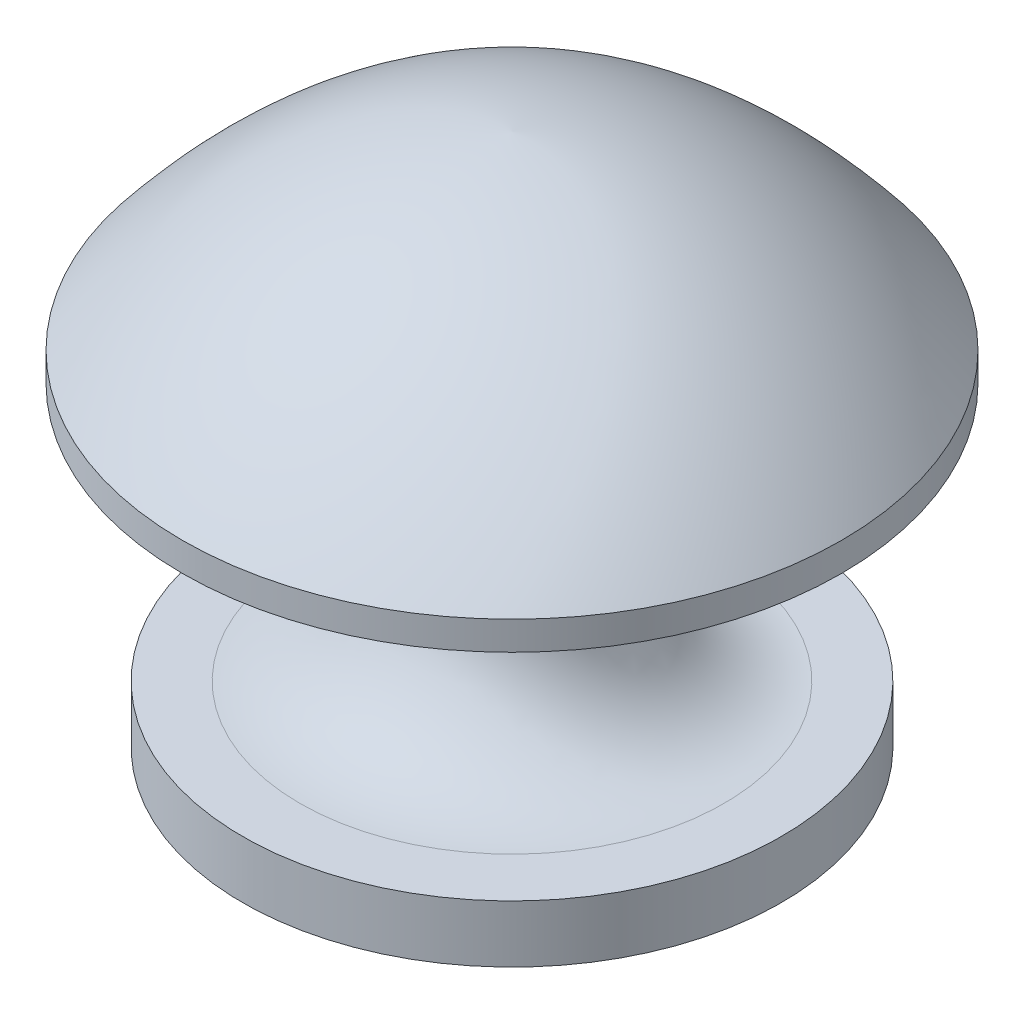
ISO-10303-21;
HEADER;
FILE_DESCRIPTION(('STEP AP214'),'2;1');
FILE_NAME('part.step','',(''),(''),'','','');
FILE_SCHEMA(('AUTOMOTIVE_DESIGN { 1 0 10303 214 1 1 1 1 }'));
ENDSEC;
DATA;
#1=APPLICATION_CONTEXT('core data for automotive mechanical design processes');
#2=APPLICATION_PROTOCOL_DEFINITION('international standard','automotive_design',2000,#1);
#3=PRODUCT_CONTEXT('',#1,'mechanical');
#4=PRODUCT('Part','Part','',(#3));
#5=PRODUCT_RELATED_PRODUCT_CATEGORY('part','',(#4));
#6=PRODUCT_DEFINITION_FORMATION('','',#4);
#7=PRODUCT_DEFINITION_CONTEXT('part definition',#1,'design');
#8=PRODUCT_DEFINITION('design','',#6,#7);
#9=PRODUCT_DEFINITION_SHAPE('','',#8);
#10=(LENGTH_UNIT() NAMED_UNIT(*) SI_UNIT(.MILLI.,.METRE.));
#11=(NAMED_UNIT(*) PLANE_ANGLE_UNIT() SI_UNIT($,.RADIAN.));
#12=(NAMED_UNIT(*) SI_UNIT($,.STERADIAN.) SOLID_ANGLE_UNIT());
#13=UNCERTAINTY_MEASURE_WITH_UNIT(LENGTH_MEASURE(1.E-05),#10,'distance_accuracy_value','');
#14=(GEOMETRIC_REPRESENTATION_CONTEXT(3) GLOBAL_UNCERTAINTY_ASSIGNED_CONTEXT((#13)) GLOBAL_UNIT_ASSIGNED_CONTEXT((#10,
#11,#12)) REPRESENTATION_CONTEXT('',''));
#15=CARTESIAN_POINT('',(0.,0.,0.));
#16=DIRECTION('',(0.,0.,1.));
#17=DIRECTION('',(1.,0.,0.));
#18=AXIS2_PLACEMENT_3D('',#15,#16,#17);
#19=CARTESIAN_POINT('',(0.,23.622,0.));
#20=CARTESIAN_POINT('',(-8.27898841801025,23.0942129041675,0.));
#21=CARTESIAN_POINT('',(-14.605,15.24,0.));
#22=B_SPLINE_CURVE_WITH_KNOTS('',2,(#19,#20,#21),.UNSPECIFIED.,.F.,.F.,(3,3),(0.,
0.874066548359226),.UNSPECIFIED.);
#23=CARTESIAN_POINT('',(0.,0.,0.));
#24=DIRECTION('',(0.,-1.,0.));
#25=AXIS1_PLACEMENT('',#23,#24);
#26=SURFACE_OF_REVOLUTION('',#22,#25);
#27=CARTESIAN_POINT('',(0.,15.24,0.));
#28=DIRECTION('',(0.,-1.,0.));
#29=DIRECTION('',(0.,0.,-1.));
#30=AXIS2_PLACEMENT_3D('',#27,#28,#29);
#31=CIRCLE('',#30,14.605);
#32=CARTESIAN_POINT('',(0.,15.24,-14.605));
#33=VERTEX_POINT('',#32);
#34=EDGE_CURVE('E11',#33,#33,#31,.T.);
#35=ORIENTED_EDGE('',*,*,#34,.F.);
#36=EDGE_LOOP('',(#35));
#37=FACE_BOUND('',#36,.T.);
#38=CARTESIAN_POINT('',(0.,23.622,0.));
#39=VERTEX_POINT('',#38);
#40=VERTEX_LOOP('',#39);
#41=FACE_BOUND('',#40,.T.);
#42=ADVANCED_FACE('F44',(#37,#41),#26,.T.);
#43=CARTESIAN_POINT('',(0.,0.,0.));
#44=DIRECTION('',(0.,-1.,0.));
#45=DIRECTION('',(0.,0.,-1.));
#46=AXIS2_PLACEMENT_3D('',#43,#44,#45);
#47=CYLINDRICAL_SURFACE('',#46,14.605);
#48=CARTESIAN_POINT('',(0.,13.97,0.));
#49=DIRECTION('',(0.,-1.,0.));
#50=DIRECTION('',(0.,0.,-1.));
#51=AXIS2_PLACEMENT_3D('',#48,#49,#50);
#52=CIRCLE('',#51,14.605);
#53=CARTESIAN_POINT('',(0.,13.97,-14.605));
#54=VERTEX_POINT('',#53);
#55=EDGE_CURVE('E52',#54,#54,#52,.T.);
#56=ORIENTED_EDGE('',*,*,#55,.F.);
#57=EDGE_LOOP('',(#56));
#58=FACE_BOUND('',#57,.T.);
#59=ORIENTED_EDGE('',*,*,#34,.T.);
#60=EDGE_LOOP('',(#59));
#61=FACE_BOUND('',#60,.T.);
#62=ADVANCED_FACE('F60',(#58,#61),#47,.T.);
#63=CARTESIAN_POINT('',(-9.398,13.97,0.));
#64=DIRECTION('',(0.,1.,0.));
#65=DIRECTION('',(0.,0.,1.));
#66=AXIS2_PLACEMENT_3D('',#63,#64,#65);
#67=PLANE('',#66);
#68=CARTESIAN_POINT('',(0.,13.97,0.));
#69=DIRECTION('',(0.,-1.,0.));
#70=DIRECTION('',(0.,0.,-1.));
#71=AXIS2_PLACEMENT_3D('',#68,#69,#70);
#72=CIRCLE('',#71,9.398);
#73=CARTESIAN_POINT('',(0.,13.97,-9.398));
#74=VERTEX_POINT('',#73);
#75=EDGE_CURVE('E110',#74,#74,#72,.T.);
#76=ORIENTED_EDGE('',*,*,#75,.F.);
#77=EDGE_LOOP('',(#76));
#78=FACE_BOUND('',#77,.T.);
#79=ORIENTED_EDGE('',*,*,#55,.T.);
#80=EDGE_LOOP('',(#79));
#81=FACE_BOUND('',#80,.T.);
#82=ADVANCED_FACE('F65',(#78,#81),#67,.F.);
#83=CARTESIAN_POINT('',(0.,8.255,0.));
#84=DIRECTION('',(0.,-1.,0.));
#85=DIRECTION('',(0.,0.,-1.));
#86=AXIS2_PLACEMENT_3D('',#83,#84,#85);
#87=TOROIDAL_SURFACE('',#86,9.398,5.715);
#88=CARTESIAN_POINT('',(0.,2.54,0.));
#89=DIRECTION('',(0.,-1.,0.));
#90=DIRECTION('',(0.,0.,-1.));
#91=AXIS2_PLACEMENT_3D('',#88,#89,#90);
#92=CIRCLE('',#91,9.398);
#93=CARTESIAN_POINT('',(0.,2.54,-9.398));
#94=VERTEX_POINT('',#93);
#95=EDGE_CURVE('E98',#94,#94,#92,.T.);
#96=ORIENTED_EDGE('',*,*,#95,.F.);
#97=EDGE_LOOP('',(#96));
#98=FACE_BOUND('',#97,.T.);
#99=ORIENTED_EDGE('',*,*,#75,.T.);
#100=EDGE_LOOP('',(#99));
#101=FACE_BOUND('',#100,.T.);
#102=ADVANCED_FACE('F66',(#98,#101),#87,.F.);
#103=CARTESIAN_POINT('',(-11.938,2.54,0.));
#104=DIRECTION('',(0.,-1.,0.));
#105=DIRECTION('',(0.,0.,-1.));
#106=AXIS2_PLACEMENT_3D('',#103,#104,#105);
#107=PLANE('',#106);
#108=CARTESIAN_POINT('',(0.,2.54,0.));
#109=DIRECTION('',(0.,-1.,0.));
#110=DIRECTION('',(0.,0.,-1.));
#111=AXIS2_PLACEMENT_3D('',#108,#109,#110);
#112=CIRCLE('',#111,11.938);
#113=CARTESIAN_POINT('',(0.,2.54,-11.938));
#114=VERTEX_POINT('',#113);
#115=EDGE_CURVE('E94',#114,#114,#112,.T.);
#116=ORIENTED_EDGE('',*,*,#115,.F.);
#117=EDGE_LOOP('',(#116));
#118=FACE_BOUND('',#117,.T.);
#119=ORIENTED_EDGE('',*,*,#95,.T.);
#120=EDGE_LOOP('',(#119));
#121=FACE_BOUND('',#120,.T.);
#122=ADVANCED_FACE('F77',(#118,#121),#107,.F.);
#123=CARTESIAN_POINT('',(0.,0.,0.));
#124=DIRECTION('',(0.,-1.,0.));
#125=DIRECTION('',(0.,0.,-1.));
#126=AXIS2_PLACEMENT_3D('',#123,#124,#125);
#127=CYLINDRICAL_SURFACE('',#126,11.938);
#128=CARTESIAN_POINT('',(0.,0.,0.));
#129=DIRECTION('',(0.,-1.,0.));
#130=DIRECTION('',(0.,0.,-1.));
#131=AXIS2_PLACEMENT_3D('',#128,#129,#130);
#132=CIRCLE('',#131,11.938);
#133=CARTESIAN_POINT('',(0.,0.,-11.938));
#134=VERTEX_POINT('',#133);
#135=EDGE_CURVE('E95',#134,#134,#132,.T.);
#136=ORIENTED_EDGE('',*,*,#135,.F.);
#137=EDGE_LOOP('',(#136));
#138=FACE_BOUND('',#137,.T.);
#139=ORIENTED_EDGE('',*,*,#115,.T.);
#140=EDGE_LOOP('',(#139));
#141=FACE_BOUND('',#140,.T.);
#142=ADVANCED_FACE('F78',(#138,#141),#127,.T.);
#143=CARTESIAN_POINT('',(0.,0.,0.));
#144=DIRECTION('',(0.,1.,0.));
#145=DIRECTION('',(0.,0.,1.));
#146=AXIS2_PLACEMENT_3D('',#143,#144,#145);
#147=PLANE('',#146);
#148=ORIENTED_EDGE('',*,*,#135,.T.);
#149=EDGE_LOOP('',(#148));
#150=FACE_BOUND('',#149,.T.);
#151=ADVANCED_FACE('F81',(#150),#147,.F.);
#152=CLOSED_SHELL('',(#42,#62,#82,#102,#122,#142,#151));
#153=MANIFOLD_SOLID_BREP('B2',#152);
#154=ADVANCED_BREP_SHAPE_REPRESENTATION('',(#18,#153),#14);
#155=SHAPE_DEFINITION_REPRESENTATION(#9,#154);
ENDSEC;
END-ISO-10303-21;
